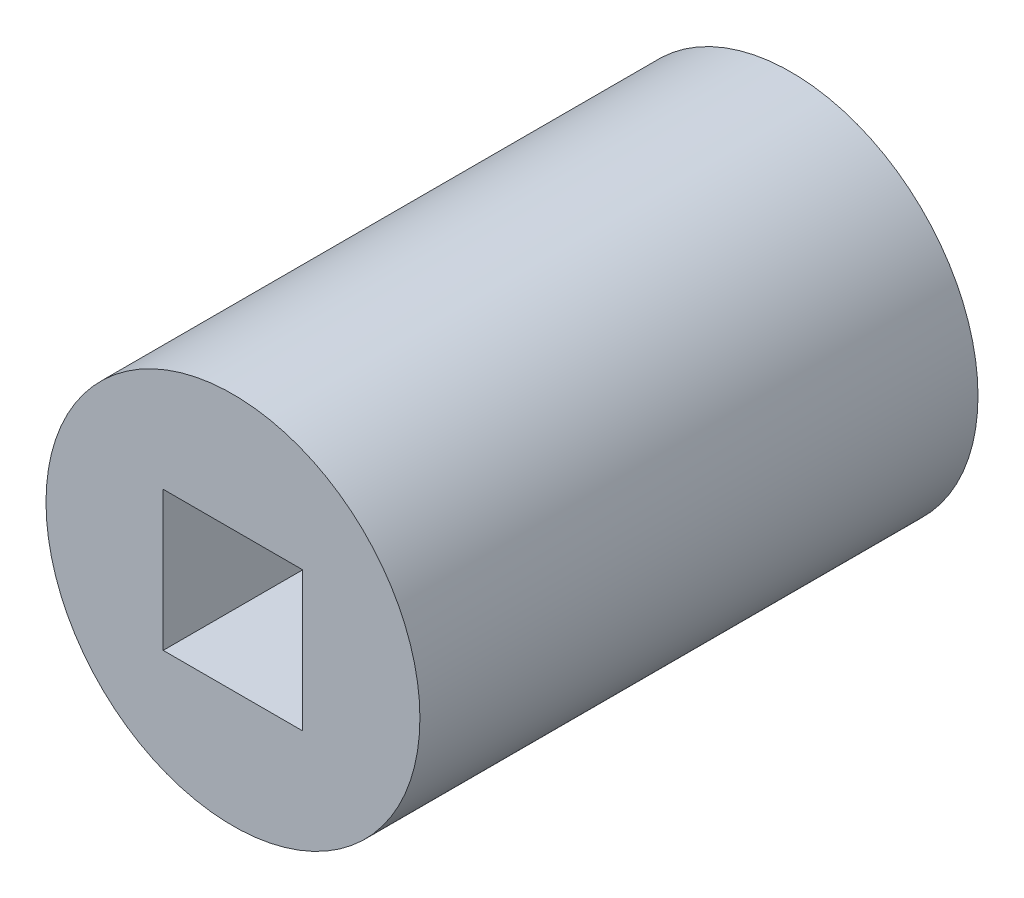
ISO-10303-21;
HEADER;
FILE_DESCRIPTION(('STEP AP214'),'2;1');
FILE_NAME('part.step','',(''),(''),'','','');
FILE_SCHEMA(('AUTOMOTIVE_DESIGN { 1 0 10303 214 1 1 1 1 }'));
ENDSEC;
DATA;
#1=APPLICATION_CONTEXT('core data for automotive mechanical design processes');
#2=APPLICATION_PROTOCOL_DEFINITION('international standard','automotive_design',2000,#1);
#3=PRODUCT_CONTEXT('',#1,'mechanical');
#4=PRODUCT('Part','Part','',(#3));
#5=PRODUCT_RELATED_PRODUCT_CATEGORY('part','',(#4));
#6=PRODUCT_DEFINITION_FORMATION('','',#4);
#7=PRODUCT_DEFINITION_CONTEXT('part definition',#1,'design');
#8=PRODUCT_DEFINITION('design','',#6,#7);
#9=PRODUCT_DEFINITION_SHAPE('','',#8);
#10=(LENGTH_UNIT() NAMED_UNIT(*) SI_UNIT(.MILLI.,.METRE.));
#11=(NAMED_UNIT(*) PLANE_ANGLE_UNIT() SI_UNIT($,.RADIAN.));
#12=(NAMED_UNIT(*) SI_UNIT($,.STERADIAN.) SOLID_ANGLE_UNIT());
#13=UNCERTAINTY_MEASURE_WITH_UNIT(LENGTH_MEASURE(1.E-05),#10,'distance_accuracy_value','');
#14=(GEOMETRIC_REPRESENTATION_CONTEXT(3) GLOBAL_UNCERTAINTY_ASSIGNED_CONTEXT((#13)) GLOBAL_UNIT_ASSIGNED_CONTEXT((#10,
#11,#12)) REPRESENTATION_CONTEXT('',''));
#15=CARTESIAN_POINT('',(0.,0.,0.));
#16=DIRECTION('',(0.,0.,1.));
#17=DIRECTION('',(1.,0.,0.));
#18=AXIS2_PLACEMENT_3D('',#15,#16,#17);
#19=CARTESIAN_POINT('',(0.,0.,10.));
#20=DIRECTION('',(0.,0.,-1.));
#21=DIRECTION('',(-1.,0.,0.));
#22=AXIS2_PLACEMENT_3D('',#19,#20,#21);
#23=CYLINDRICAL_SURFACE('',#22,3.35);
#24=CARTESIAN_POINT('',(0.,0.,10.));
#25=DIRECTION('',(0.,0.,1.));
#26=DIRECTION('',(1.,0.,0.));
#27=AXIS2_PLACEMENT_3D('',#24,#25,#26);
#28=CIRCLE('',#27,3.35);
#29=CARTESIAN_POINT('',(3.35,0.,10.));
#30=VERTEX_POINT('',#29);
#31=EDGE_CURVE('E11',#30,#30,#28,.T.);
#32=ORIENTED_EDGE('',*,*,#31,.F.);
#33=EDGE_LOOP('',(#32));
#34=FACE_BOUND('',#33,.T.);
#35=CARTESIAN_POINT('',(0.,0.,0.));
#36=DIRECTION('',(0.,0.,1.));
#37=DIRECTION('',(1.,0.,0.));
#38=AXIS2_PLACEMENT_3D('',#35,#36,#37);
#39=CIRCLE('',#38,3.35);
#40=CARTESIAN_POINT('',(3.35,0.,0.));
#41=VERTEX_POINT('',#40);
#42=EDGE_CURVE('E48',#41,#41,#39,.T.);
#43=ORIENTED_EDGE('',*,*,#42,.T.);
#44=EDGE_LOOP('',(#43));
#45=FACE_BOUND('',#44,.T.);
#46=ADVANCED_FACE('F39',(#34,#45),#23,.T.);
#47=CARTESIAN_POINT('',(0.,0.,10.));
#48=DIRECTION('',(0.,0.,1.));
#49=DIRECTION('',(1.,0.,0.));
#50=AXIS2_PLACEMENT_3D('',#47,#48,#49);
#51=PLANE('',#50);
#52=DIRECTION('',(0.,1.,0.));
#53=VECTOR('',#52,1.);
#54=CARTESIAN_POINT('',(1.25,1.25,10.));
#55=LINE('',#54,#53);
#56=CARTESIAN_POINT('',(1.25,-1.25,10.));
#57=VERTEX_POINT('',#56);
#58=CARTESIAN_POINT('',(1.25,1.25,10.));
#59=VERTEX_POINT('',#58);
#60=EDGE_CURVE('E56',#57,#59,#55,.T.);
#61=ORIENTED_EDGE('',*,*,#60,.F.);
#62=DIRECTION('',(1.,0.,0.));
#63=VECTOR('',#62,1.);
#64=CARTESIAN_POINT('',(-1.25,-1.25,10.));
#65=LINE('',#64,#63);
#66=CARTESIAN_POINT('',(-1.25,-1.25,10.));
#67=VERTEX_POINT('',#66);
#68=EDGE_CURVE('E111',#67,#57,#65,.T.);
#69=ORIENTED_EDGE('',*,*,#68,.F.);
#70=DIRECTION('',(0.,-1.,0.));
#71=VECTOR('',#70,1.);
#72=CARTESIAN_POINT('',(-1.25,1.25,10.));
#73=LINE('',#72,#71);
#74=CARTESIAN_POINT('',(-1.25,1.25,10.));
#75=VERTEX_POINT('',#74);
#76=EDGE_CURVE('E122',#75,#67,#73,.T.);
#77=ORIENTED_EDGE('',*,*,#76,.F.);
#78=DIRECTION('',(-1.,0.,0.));
#79=VECTOR('',#78,1.);
#80=CARTESIAN_POINT('',(-1.25,1.25,10.));
#81=LINE('',#80,#79);
#82=EDGE_CURVE('E91',#59,#75,#81,.T.);
#83=ORIENTED_EDGE('',*,*,#82,.F.);
#84=EDGE_LOOP('',(#61,#69,#77,#83));
#85=FACE_BOUND('',#84,.T.);
#86=ORIENTED_EDGE('',*,*,#31,.T.);
#87=EDGE_LOOP('',(#86));
#88=FACE_BOUND('',#87,.T.);
#89=ADVANCED_FACE('F140',(#85,#88),#51,.T.);
#90=CARTESIAN_POINT('',(0.,0.,0.));
#91=DIRECTION('',(0.,0.,1.));
#92=DIRECTION('',(1.,0.,0.));
#93=AXIS2_PLACEMENT_3D('',#90,#91,#92);
#94=PLANE('',#93);
#95=CARTESIAN_POINT('',(0.,0.,0.));
#96=DIRECTION('',(0.,0.,-1.));
#97=DIRECTION('',(-1.,0.,0.));
#98=AXIS2_PLACEMENT_3D('',#95,#96,#97);
#99=CIRCLE('',#98,2.35);
#100=CARTESIAN_POINT('',(-2.35,0.,0.));
#101=VERTEX_POINT('',#100);
#102=EDGE_CURVE('E247',#101,#101,#99,.T.);
#103=ORIENTED_EDGE('',*,*,#102,.F.);
#104=EDGE_LOOP('',(#103));
#105=FACE_BOUND('',#104,.T.);
#106=ORIENTED_EDGE('',*,*,#42,.F.);
#107=EDGE_LOOP('',(#106));
#108=FACE_BOUND('',#107,.T.);
#109=ADVANCED_FACE('F137',(#105,#108),#94,.F.);
#110=CARTESIAN_POINT('',(1.25,1.25,5.));
#111=DIRECTION('',(1.,0.,0.));
#112=DIRECTION('',(0.,1.,0.));
#113=AXIS2_PLACEMENT_3D('',#110,#111,#112);
#114=PLANE('',#113);
#115=ORIENTED_EDGE('',*,*,#60,.T.);
#116=DIRECTION('',(0.,0.,1.));
#117=VECTOR('',#116,1.);
#118=CARTESIAN_POINT('',(1.25,1.25,5.));
#119=LINE('',#118,#117);
#120=CARTESIAN_POINT('',(1.25,1.25,5.));
#121=VERTEX_POINT('',#120);
#122=EDGE_CURVE('E79',#121,#59,#119,.T.);
#123=ORIENTED_EDGE('',*,*,#122,.F.);
#124=DIRECTION('',(0.,1.,0.));
#125=VECTOR('',#124,1.);
#126=CARTESIAN_POINT('',(1.25,1.25,5.));
#127=LINE('',#126,#125);
#128=CARTESIAN_POINT('',(1.25,-1.25,5.));
#129=VERTEX_POINT('',#128);
#130=EDGE_CURVE('E107',#129,#121,#127,.T.);
#131=ORIENTED_EDGE('',*,*,#130,.F.);
#132=DIRECTION('',(0.,0.,1.));
#133=VECTOR('',#132,1.);
#134=CARTESIAN_POINT('',(1.25,-1.25,5.));
#135=LINE('',#134,#133);
#136=EDGE_CURVE('E64',#129,#57,#135,.T.);
#137=ORIENTED_EDGE('',*,*,#136,.T.);
#138=EDGE_LOOP('',(#115,#123,#131,#137));
#139=FACE_BOUND('',#138,.T.);
#140=ADVANCED_FACE('F139',(#139),#114,.F.);
#141=CARTESIAN_POINT('',(-1.25,-1.25,5.));
#142=DIRECTION('',(0.,-1.,0.));
#143=DIRECTION('',(0.,0.,-1.));
#144=AXIS2_PLACEMENT_3D('',#141,#142,#143);
#145=PLANE('',#144);
#146=ORIENTED_EDGE('',*,*,#68,.T.);
#147=ORIENTED_EDGE('',*,*,#136,.F.);
#148=DIRECTION('',(1.,0.,0.));
#149=VECTOR('',#148,1.);
#150=CARTESIAN_POINT('',(-1.25,-1.25,5.));
#151=LINE('',#150,#149);
#152=CARTESIAN_POINT('',(-1.25,-1.25,5.));
#153=VERTEX_POINT('',#152);
#154=EDGE_CURVE('E104',#153,#129,#151,.T.);
#155=ORIENTED_EDGE('',*,*,#154,.F.);
#156=DIRECTION('',(0.,0.,1.));
#157=VECTOR('',#156,1.);
#158=CARTESIAN_POINT('',(-1.25,-1.25,5.));
#159=LINE('',#158,#157);
#160=EDGE_CURVE('E96',#153,#67,#159,.T.);
#161=ORIENTED_EDGE('',*,*,#160,.T.);
#162=EDGE_LOOP('',(#146,#147,#155,#161));
#163=FACE_BOUND('',#162,.T.);
#164=ADVANCED_FACE('F146',(#163),#145,.F.);
#165=CARTESIAN_POINT('',(-1.25,1.25,5.));
#166=DIRECTION('',(-1.,0.,0.));
#167=DIRECTION('',(0.,-1.,0.));
#168=AXIS2_PLACEMENT_3D('',#165,#166,#167);
#169=PLANE('',#168);
#170=ORIENTED_EDGE('',*,*,#76,.T.);
#171=ORIENTED_EDGE('',*,*,#160,.F.);
#172=DIRECTION('',(0.,-1.,0.));
#173=VECTOR('',#172,1.);
#174=CARTESIAN_POINT('',(-1.25,1.25,5.));
#175=LINE('',#174,#173);
#176=CARTESIAN_POINT('',(-1.25,1.25,5.));
#177=VERTEX_POINT('',#176);
#178=EDGE_CURVE('E99',#177,#153,#175,.T.);
#179=ORIENTED_EDGE('',*,*,#178,.F.);
#180=DIRECTION('',(0.,0.,1.));
#181=VECTOR('',#180,1.);
#182=CARTESIAN_POINT('',(-1.25,1.25,5.));
#183=LINE('',#182,#181);
#184=EDGE_CURVE('E84',#177,#75,#183,.T.);
#185=ORIENTED_EDGE('',*,*,#184,.T.);
#186=EDGE_LOOP('',(#170,#171,#179,#185));
#187=FACE_BOUND('',#186,.T.);
#188=ADVANCED_FACE('F100',(#187),#169,.F.);
#189=CARTESIAN_POINT('',(-1.25,1.25,5.));
#190=DIRECTION('',(0.,1.,0.));
#191=DIRECTION('',(0.,0.,1.));
#192=AXIS2_PLACEMENT_3D('',#189,#190,#191);
#193=PLANE('',#192);
#194=ORIENTED_EDGE('',*,*,#82,.T.);
#195=ORIENTED_EDGE('',*,*,#184,.F.);
#196=DIRECTION('',(-1.,0.,0.));
#197=VECTOR('',#196,1.);
#198=CARTESIAN_POINT('',(-1.25,1.25,5.));
#199=LINE('',#198,#197);
#200=EDGE_CURVE('E88',#121,#177,#199,.T.);
#201=ORIENTED_EDGE('',*,*,#200,.F.);
#202=ORIENTED_EDGE('',*,*,#122,.T.);
#203=EDGE_LOOP('',(#194,#195,#201,#202));
#204=FACE_BOUND('',#203,.T.);
#205=ADVANCED_FACE('F86',(#204),#193,.F.);
#206=CARTESIAN_POINT('',(0.,0.,5.));
#207=DIRECTION('',(0.,0.,1.));
#208=DIRECTION('',(1.,0.,0.));
#209=AXIS2_PLACEMENT_3D('',#206,#207,#208);
#210=PLANE('',#209);
#211=CARTESIAN_POINT('',(0.,0.,5.));
#212=DIRECTION('',(0.,0.,1.));
#213=DIRECTION('',(1.,0.,0.));
#214=AXIS2_PLACEMENT_3D('',#211,#212,#213);
#215=CIRCLE('',#214,1.);
#216=CARTESIAN_POINT('',(1.,0.,5.));
#217=VERTEX_POINT('',#216);
#218=EDGE_CURVE('E42',#217,#217,#215,.T.);
#219=ORIENTED_EDGE('',*,*,#218,.F.);
#220=EDGE_LOOP('',(#219));
#221=FACE_BOUND('',#220,.T.);
#222=ORIENTED_EDGE('',*,*,#130,.T.);
#223=ORIENTED_EDGE('',*,*,#200,.T.);
#224=ORIENTED_EDGE('',*,*,#178,.T.);
#225=ORIENTED_EDGE('',*,*,#154,.T.);
#226=EDGE_LOOP('',(#222,#223,#224,#225));
#227=FACE_BOUND('',#226,.T.);
#228=ADVANCED_FACE('F106',(#221,#227),#210,.T.);
#229=CARTESIAN_POINT('',(0.,0.,3.));
#230=DIRECTION('',(0.,0.,-1.));
#231=DIRECTION('',(-1.,0.,0.));
#232=AXIS2_PLACEMENT_3D('',#229,#230,#231);
#233=CYLINDRICAL_SURFACE('',#232,2.35);
#234=CARTESIAN_POINT('',(0.,0.,3.));
#235=DIRECTION('',(0.,0.,-1.));
#236=DIRECTION('',(-1.,0.,0.));
#237=AXIS2_PLACEMENT_3D('',#234,#235,#236);
#238=CIRCLE('',#237,2.35);
#239=CARTESIAN_POINT('',(-2.35,0.,3.));
#240=VERTEX_POINT('',#239);
#241=EDGE_CURVE('E119',#240,#240,#238,.T.);
#242=ORIENTED_EDGE('',*,*,#241,.F.);
#243=EDGE_LOOP('',(#242));
#244=FACE_BOUND('',#243,.T.);
#245=ORIENTED_EDGE('',*,*,#102,.T.);
#246=EDGE_LOOP('',(#245));
#247=FACE_BOUND('',#246,.T.);
#248=ADVANCED_FACE('F202',(#244,#247),#233,.F.);
#249=CARTESIAN_POINT('',(0.,0.,3.));
#250=DIRECTION('',(0.,0.,-1.));
#251=DIRECTION('',(-1.,0.,0.));
#252=AXIS2_PLACEMENT_3D('',#249,#250,#251);
#253=PLANE('',#252);
#254=CARTESIAN_POINT('',(0.,0.,3.));
#255=DIRECTION('',(0.,0.,-1.));
#256=DIRECTION('',(-1.,0.,0.));
#257=AXIS2_PLACEMENT_3D('',#254,#255,#256);
#258=CIRCLE('',#257,1.);
#259=CARTESIAN_POINT('',(-1.,0.,3.));
#260=VERTEX_POINT('',#259);
#261=EDGE_CURVE('E243',#260,#260,#258,.T.);
#262=ORIENTED_EDGE('',*,*,#261,.F.);
#263=EDGE_LOOP('',(#262));
#264=FACE_BOUND('',#263,.T.);
#265=ORIENTED_EDGE('',*,*,#241,.T.);
#266=EDGE_LOOP('',(#265));
#267=FACE_BOUND('',#266,.T.);
#268=ADVANCED_FACE('F207',(#264,#267),#253,.T.);
#269=CARTESIAN_POINT('',(0.,0.,6.));
#270=DIRECTION('',(0.,0.,-1.));
#271=DIRECTION('',(-1.,0.,0.));
#272=AXIS2_PLACEMENT_3D('',#269,#270,#271);
#273=CYLINDRICAL_SURFACE('',#272,1.);
#274=ORIENTED_EDGE('',*,*,#218,.T.);
#275=EDGE_LOOP('',(#274));
#276=FACE_BOUND('',#275,.T.);
#277=ORIENTED_EDGE('',*,*,#261,.T.);
#278=EDGE_LOOP('',(#277));
#279=FACE_BOUND('',#278,.T.);
#280=ADVANCED_FACE('F224',(#276,#279),#273,.F.);
#281=CLOSED_SHELL('',(#46,#89,#109,#140,#164,#188,#205,#228,#248,#268,#280));
#282=MANIFOLD_SOLID_BREP('B2',#281);
#283=ADVANCED_BREP_SHAPE_REPRESENTATION('',(#18,#282),#14);
#284=SHAPE_DEFINITION_REPRESENTATION(#9,#283);
ENDSEC;
END-ISO-10303-21;
